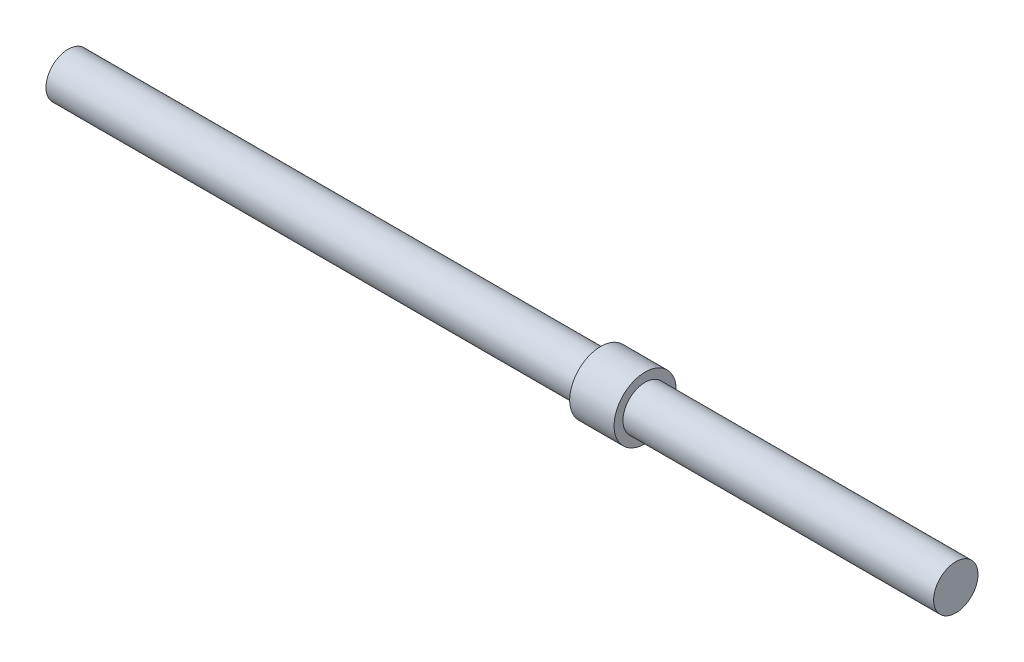
ISO-10303-21;
HEADER;
FILE_DESCRIPTION(('STEP AP214'),'2;1');
FILE_NAME('part.step','',(''),(''),'','','');
FILE_SCHEMA(('AUTOMOTIVE_DESIGN { 1 0 10303 214 1 1 1 1 }'));
ENDSEC;
DATA;
#1=APPLICATION_CONTEXT('core data for automotive mechanical design processes');
#2=APPLICATION_PROTOCOL_DEFINITION('international standard','automotive_design',2000,#1);
#3=PRODUCT_CONTEXT('',#1,'mechanical');
#4=PRODUCT('Part','Part','',(#3));
#5=PRODUCT_RELATED_PRODUCT_CATEGORY('part','',(#4));
#6=PRODUCT_DEFINITION_FORMATION('','',#4);
#7=PRODUCT_DEFINITION_CONTEXT('part definition',#1,'design');
#8=PRODUCT_DEFINITION('design','',#6,#7);
#9=PRODUCT_DEFINITION_SHAPE('','',#8);
#10=(LENGTH_UNIT() NAMED_UNIT(*) SI_UNIT(.MILLI.,.METRE.));
#11=(NAMED_UNIT(*) PLANE_ANGLE_UNIT() SI_UNIT($,.RADIAN.));
#12=(NAMED_UNIT(*) SI_UNIT($,.STERADIAN.) SOLID_ANGLE_UNIT());
#13=UNCERTAINTY_MEASURE_WITH_UNIT(LENGTH_MEASURE(1.E-05),#10,'distance_accuracy_value','');
#14=(GEOMETRIC_REPRESENTATION_CONTEXT(3) GLOBAL_UNCERTAINTY_ASSIGNED_CONTEXT((#13)) GLOBAL_UNIT_ASSIGNED_CONTEXT((#10,
#11,#12)) REPRESENTATION_CONTEXT('',''));
#15=CARTESIAN_POINT('',(0.,0.,0.));
#16=DIRECTION('',(0.,0.,1.));
#17=DIRECTION('',(1.,0.,0.));
#18=AXIS2_PLACEMENT_3D('',#15,#16,#17);
#19=CARTESIAN_POINT('',(100.,0.,0.));
#20=DIRECTION('',(-1.,0.,0.));
#21=DIRECTION('',(0.,0.,1.));
#22=AXIS2_PLACEMENT_3D('',#19,#20,#21);
#23=CYLINDRICAL_SURFACE('',#22,5.);
#24=CARTESIAN_POINT('',(-100.,0.,0.));
#25=DIRECTION('',(1.,0.,0.));
#26=DIRECTION('',(0.,0.,-1.));
#27=AXIS2_PLACEMENT_3D('',#24,#25,#26);
#28=CIRCLE('',#27,5.);
#29=CARTESIAN_POINT('',(-100.,0.,-5.));
#30=VERTEX_POINT('',#29);
#31=EDGE_CURVE('E49',#30,#30,#28,.T.);
#32=ORIENTED_EDGE('',*,*,#31,.T.);
#33=EDGE_LOOP('',(#32));
#34=FACE_BOUND('',#33,.T.);
#35=CARTESIAN_POINT('',(20.,0.,0.));
#36=DIRECTION('',(1.,0.,0.));
#37=DIRECTION('',(0.,0.,-1.));
#38=AXIS2_PLACEMENT_3D('',#35,#36,#37);
#39=CIRCLE('',#38,5.);
#40=CARTESIAN_POINT('',(20.,0.,-5.));
#41=VERTEX_POINT('',#40);
#42=EDGE_CURVE('E10',#41,#41,#39,.T.);
#43=ORIENTED_EDGE('',*,*,#42,.F.);
#44=EDGE_LOOP('',(#43));
#45=FACE_BOUND('',#44,.T.);
#46=ADVANCED_FACE('F39',(#34,#45),#23,.T.);
#47=CARTESIAN_POINT('',(-100.,0.,0.));
#48=DIRECTION('',(1.,0.,0.));
#49=DIRECTION('',(0.,0.,-1.));
#50=AXIS2_PLACEMENT_3D('',#47,#48,#49);
#51=PLANE('',#50);
#52=ORIENTED_EDGE('',*,*,#31,.F.);
#53=EDGE_LOOP('',(#52));
#54=FACE_BOUND('',#53,.T.);
#55=ADVANCED_FACE('F73',(#54),#51,.F.);
#56=CARTESIAN_POINT('',(20.,0.,0.));
#57=DIRECTION('',(1.,0.,0.));
#58=DIRECTION('',(0.,0.,-1.));
#59=AXIS2_PLACEMENT_3D('',#56,#57,#58);
#60=CYLINDRICAL_SURFACE('',#59,7.);
#61=CARTESIAN_POINT('',(20.,0.,0.));
#62=DIRECTION('',(1.,0.,0.));
#63=DIRECTION('',(0.,0.,-1.));
#64=AXIS2_PLACEMENT_3D('',#61,#62,#63);
#65=CIRCLE('',#64,7.);
#66=CARTESIAN_POINT('',(20.,0.,-7.));
#67=VERTEX_POINT('',#66);
#68=EDGE_CURVE('E62',#67,#67,#65,.T.);
#69=ORIENTED_EDGE('',*,*,#68,.T.);
#70=EDGE_LOOP('',(#69));
#71=FACE_BOUND('',#70,.T.);
#72=CARTESIAN_POINT('',(30.,0.,0.));
#73=DIRECTION('',(1.,0.,0.));
#74=DIRECTION('',(0.,0.,-1.));
#75=AXIS2_PLACEMENT_3D('',#72,#73,#74);
#76=CIRCLE('',#75,7.);
#77=CARTESIAN_POINT('',(30.,0.,-7.));
#78=VERTEX_POINT('',#77);
#79=EDGE_CURVE('E59',#78,#78,#76,.T.);
#80=ORIENTED_EDGE('',*,*,#79,.F.);
#81=EDGE_LOOP('',(#80));
#82=FACE_BOUND('',#81,.T.);
#83=ADVANCED_FACE('F75',(#71,#82),#60,.T.);
#84=CARTESIAN_POINT('',(20.,0.,0.));
#85=DIRECTION('',(1.,0.,0.));
#86=DIRECTION('',(0.,0.,-1.));
#87=AXIS2_PLACEMENT_3D('',#84,#85,#86);
#88=PLANE('',#87);
#89=ORIENTED_EDGE('',*,*,#42,.T.);
#90=EDGE_LOOP('',(#89));
#91=FACE_BOUND('',#90,.T.);
#92=ORIENTED_EDGE('',*,*,#68,.F.);
#93=EDGE_LOOP('',(#92));
#94=FACE_BOUND('',#93,.T.);
#95=ADVANCED_FACE('F74',(#91,#94),#88,.F.);
#96=CARTESIAN_POINT('',(30.,0.,0.));
#97=DIRECTION('',(1.,0.,0.));
#98=DIRECTION('',(0.,0.,-1.));
#99=AXIS2_PLACEMENT_3D('',#96,#97,#98);
#100=PLANE('',#99);
#101=CARTESIAN_POINT('',(30.,0.,0.));
#102=DIRECTION('',(1.,0.,0.));
#103=DIRECTION('',(0.,0.,-1.));
#104=AXIS2_PLACEMENT_3D('',#101,#102,#103);
#105=CIRCLE('',#104,5.);
#106=CARTESIAN_POINT('',(30.,0.,-5.));
#107=VERTEX_POINT('',#106);
#108=EDGE_CURVE('E54',#107,#107,#105,.T.);
#109=ORIENTED_EDGE('',*,*,#108,.F.);
#110=EDGE_LOOP('',(#109));
#111=FACE_BOUND('',#110,.T.);
#112=ORIENTED_EDGE('',*,*,#79,.T.);
#113=EDGE_LOOP('',(#112));
#114=FACE_BOUND('',#113,.T.);
#115=ADVANCED_FACE('F70',(#111,#114),#100,.T.);
#116=CARTESIAN_POINT('',(100.,0.,0.));
#117=DIRECTION('',(1.,0.,0.));
#118=DIRECTION('',(0.,0.,-1.));
#119=AXIS2_PLACEMENT_3D('',#116,#117,#118);
#120=PLANE('',#119);
#121=CARTESIAN_POINT('',(100.,0.,0.));
#122=DIRECTION('',(1.,0.,0.));
#123=DIRECTION('',(0.,0.,-1.));
#124=AXIS2_PLACEMENT_3D('',#121,#122,#123);
#125=CIRCLE('',#124,5.);
#126=CARTESIAN_POINT('',(100.,0.,-5.));
#127=VERTEX_POINT('',#126);
#128=EDGE_CURVE('E46',#127,#127,#125,.T.);
#129=ORIENTED_EDGE('',*,*,#128,.T.);
#130=EDGE_LOOP('',(#129));
#131=FACE_BOUND('',#130,.T.);
#132=ADVANCED_FACE('F93',(#131),#120,.T.);
#133=ORIENTED_EDGE('',*,*,#108,.T.);
#134=EDGE_LOOP('',(#133));
#135=FACE_BOUND('',#134,.T.);
#136=ORIENTED_EDGE('',*,*,#128,.F.);
#137=EDGE_LOOP('',(#136));
#138=FACE_BOUND('',#137,.T.);
#139=ADVANCED_FACE('F41',(#135,#138),#23,.T.);
#140=CLOSED_SHELL('',(#46,#55,#83,#95,#115,#132,#139));
#141=MANIFOLD_SOLID_BREP('B2',#140);
#142=ADVANCED_BREP_SHAPE_REPRESENTATION('',(#18,#141),#14);
#143=SHAPE_DEFINITION_REPRESENTATION(#9,#142);
ENDSEC;
END-ISO-10303-21;
